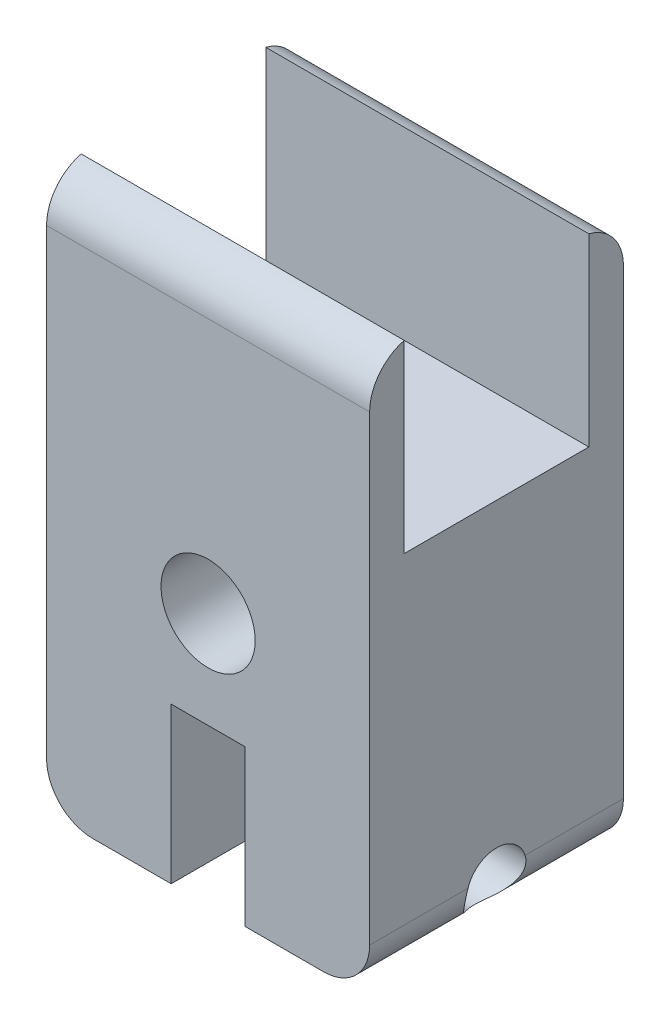
ISO-10303-21;
HEADER;
FILE_DESCRIPTION(('STEP AP214'),'2;1');
FILE_NAME('part.step','',(''),(''),'','','');
FILE_SCHEMA(('AUTOMOTIVE_DESIGN { 1 0 10303 214 1 1 1 1 }'));
ENDSEC;
DATA;
#1=APPLICATION_CONTEXT('core data for automotive mechanical design processes');
#2=APPLICATION_PROTOCOL_DEFINITION('international standard','automotive_design',2000,#1);
#3=PRODUCT_CONTEXT('',#1,'mechanical');
#4=PRODUCT('Part','Part','',(#3));
#5=PRODUCT_RELATED_PRODUCT_CATEGORY('part','',(#4));
#6=PRODUCT_DEFINITION_FORMATION('','',#4);
#7=PRODUCT_DEFINITION_CONTEXT('part definition',#1,'design');
#8=PRODUCT_DEFINITION('design','',#6,#7);
#9=PRODUCT_DEFINITION_SHAPE('','',#8);
#10=(LENGTH_UNIT() NAMED_UNIT(*) SI_UNIT(.MILLI.,.METRE.));
#11=(NAMED_UNIT(*) PLANE_ANGLE_UNIT() SI_UNIT($,.RADIAN.));
#12=(NAMED_UNIT(*) SI_UNIT($,.STERADIAN.) SOLID_ANGLE_UNIT());
#13=UNCERTAINTY_MEASURE_WITH_UNIT(LENGTH_MEASURE(1.E-05),#10,'distance_accuracy_value','');
#14=(GEOMETRIC_REPRESENTATION_CONTEXT(3) GLOBAL_UNCERTAINTY_ASSIGNED_CONTEXT((#13)) GLOBAL_UNIT_ASSIGNED_CONTEXT((#10,
#11,#12)) REPRESENTATION_CONTEXT('',''));
#15=CARTESIAN_POINT('',(0.,0.,0.));
#16=DIRECTION('',(0.,0.,1.));
#17=DIRECTION('',(1.,0.,0.));
#18=AXIS2_PLACEMENT_3D('',#15,#16,#17);
#19=CARTESIAN_POINT('',(0.,0.,27.5));
#20=DIRECTION('',(0.,0.,1.));
#21=DIRECTION('',(1.,0.,0.));
#22=AXIS2_PLACEMENT_3D('',#19,#20,#21);
#23=PLANE('',#22);
#24=CARTESIAN_POINT('',(17.5,-17.5,27.5));
#25=DIRECTION('',(0.,0.,1.));
#26=DIRECTION('',(1.,0.,0.));
#27=AXIS2_PLACEMENT_3D('',#24,#25,#26);
#28=CIRCLE('',#27,5.1);
#29=CARTESIAN_POINT('',(22.6,-17.5,27.5));
#30=VERTEX_POINT('',#29);
#31=EDGE_CURVE('E283',#30,#30,#28,.T.);
#32=ORIENTED_EDGE('',*,*,#31,.F.);
#33=EDGE_LOOP('',(#32));
#34=FACE_BOUND('',#33,.T.);
#35=DIRECTION('',(0.,1.,0.));
#36=VECTOR('',#35,1.);
#37=CARTESIAN_POINT('',(35.,0.,27.5));
#38=LINE('',#37,#36);
#39=CARTESIAN_POINT('',(35.,-39.86,27.5));
#40=VERTEX_POINT('',#39);
#41=CARTESIAN_POINT('',(35.,10.1587708172407,27.5));
#42=VERTEX_POINT('',#41);
#43=EDGE_CURVE('E293',#40,#42,#38,.T.);
#44=ORIENTED_EDGE('',*,*,#43,.T.);
#45=DIRECTION('',(1.,0.,0.));
#46=VECTOR('',#45,1.);
#47=CARTESIAN_POINT('',(0.,10.1587708172407,27.5));
#48=LINE('',#47,#46);
#49=CARTESIAN_POINT('',(0.,10.1587708172407,27.5));
#50=VERTEX_POINT('',#49);
#51=EDGE_CURVE('E11',#42,#50,#48,.F.);
#52=ORIENTED_EDGE('',*,*,#51,.T.);
#53=DIRECTION('',(0.,-1.,0.));
#54=VECTOR('',#53,1.);
#55=CARTESIAN_POINT('',(0.,0.,27.5));
#56=LINE('',#55,#54);
#57=CARTESIAN_POINT('',(0.,-39.86,27.5));
#58=VERTEX_POINT('',#57);
#59=EDGE_CURVE('E287',#50,#58,#56,.T.);
#60=ORIENTED_EDGE('',*,*,#59,.T.);
#61=CARTESIAN_POINT('',(5.00000000000001,-39.86,27.5));
#62=DIRECTION('',(0.,0.,1.));
#63=DIRECTION('',(1.,0.,0.));
#64=AXIS2_PLACEMENT_3D('',#61,#62,#63);
#65=CIRCLE('',#64,5.);
#66=CARTESIAN_POINT('',(5.,-44.86,27.5));
#67=VERTEX_POINT('',#66);
#68=EDGE_CURVE('E320',#58,#67,#65,.T.);
#69=ORIENTED_EDGE('',*,*,#68,.T.);
#70=DIRECTION('',(-1.,0.,0.));
#71=VECTOR('',#70,1.);
#72=CARTESIAN_POINT('',(35.,-44.86,27.5));
#73=LINE('',#72,#71);
#74=CARTESIAN_POINT('',(13.5,-44.86,27.5));
#75=VERTEX_POINT('',#74);
#76=EDGE_CURVE('E271',#75,#67,#73,.T.);
#77=ORIENTED_EDGE('',*,*,#76,.F.);
#78=DIRECTION('',(0.,-1.,0.));
#79=VECTOR('',#78,1.);
#80=CARTESIAN_POINT('',(13.5,-28.,27.5));
#81=LINE('',#80,#79);
#82=CARTESIAN_POINT('',(13.5,-28.,27.5));
#83=VERTEX_POINT('',#82);
#84=EDGE_CURVE('E218',#83,#75,#81,.T.);
#85=ORIENTED_EDGE('',*,*,#84,.F.);
#86=DIRECTION('',(1.,0.,0.));
#87=VECTOR('',#86,1.);
#88=CARTESIAN_POINT('',(13.5,-28.,27.5));
#89=LINE('',#88,#87);
#90=CARTESIAN_POINT('',(21.5,-28.,27.5));
#91=VERTEX_POINT('',#90);
#92=EDGE_CURVE('E226',#83,#91,#89,.T.);
#93=ORIENTED_EDGE('',*,*,#92,.T.);
#94=DIRECTION('',(0.,-1.,0.));
#95=VECTOR('',#94,1.);
#96=CARTESIAN_POINT('',(21.5,-28.,27.5));
#97=LINE('',#96,#95);
#98=CARTESIAN_POINT('',(21.5,-44.86,27.5));
#99=VERTEX_POINT('',#98);
#100=EDGE_CURVE('E221',#91,#99,#97,.T.);
#101=ORIENTED_EDGE('',*,*,#100,.T.);
#102=CARTESIAN_POINT('',(30.,-44.86,27.5));
#103=VERTEX_POINT('',#102);
#104=EDGE_CURVE('E280',#103,#99,#73,.T.);
#105=ORIENTED_EDGE('',*,*,#104,.F.);
#106=CARTESIAN_POINT('',(30.,-39.86,27.5));
#107=DIRECTION('',(0.,0.,1.));
#108=DIRECTION('',(1.,0.,0.));
#109=AXIS2_PLACEMENT_3D('',#106,#107,#108);
#110=CIRCLE('',#109,5.);
#111=EDGE_CURVE('E323',#103,#40,#110,.T.);
#112=ORIENTED_EDGE('',*,*,#111,.T.);
#113=EDGE_LOOP('',(#44,#52,#60,#69,#77,#85,#93,#101,#105,#112));
#114=FACE_BOUND('',#113,.T.);
#115=ADVANCED_FACE('F40',(#34,#114),#23,.T.);
#116=CARTESIAN_POINT('',(35.,-44.86,0.));
#117=DIRECTION('',(0.,-1.,0.));
#118=DIRECTION('',(1.,0.,0.));
#119=AXIS2_PLACEMENT_3D('',#116,#117,#118);
#120=PLANE('',#119);
#121=ORIENTED_EDGE('',*,*,#76,.T.);
#122=DIRECTION('',(0.,0.,1.));
#123=VECTOR('',#122,1.);
#124=CARTESIAN_POINT('',(5.00000000000001,-44.86,0.));
#125=LINE('',#124,#123);
#126=CARTESIAN_POINT('',(5.,-44.86,0.));
#127=VERTEX_POINT('',#126);
#128=EDGE_CURVE('E368',#67,#127,#125,.F.);
#129=ORIENTED_EDGE('',*,*,#128,.T.);
#130=DIRECTION('',(-1.,0.,0.));
#131=VECTOR('',#130,1.);
#132=CARTESIAN_POINT('',(35.,-44.86,0.));
#133=LINE('',#132,#131);
#134=CARTESIAN_POINT('',(13.5,-44.86,0.));
#135=VERTEX_POINT('',#134);
#136=EDGE_CURVE('E279',#135,#127,#133,.T.);
#137=ORIENTED_EDGE('',*,*,#136,.F.);
#138=DIRECTION('',(0.,0.,-1.));
#139=VECTOR('',#138,1.);
#140=CARTESIAN_POINT('',(13.5,-44.86,27.5));
#141=LINE('',#140,#139);
#142=EDGE_CURVE('E251',#75,#135,#141,.T.);
#143=ORIENTED_EDGE('',*,*,#142,.F.);
#144=EDGE_LOOP('',(#121,#129,#137,#143));
#145=FACE_BOUND('',#144,.T.);
#146=ADVANCED_FACE('F388',(#145),#120,.T.);
#147=CARTESIAN_POINT('',(35.,-40.86,13.75));
#148=DIRECTION('',(-1.,0.,0.));
#149=DIRECTION('',(0.,-1.,0.));
#150=AXIS2_PLACEMENT_3D('',#147,#148,#149);
#151=CYLINDRICAL_SURFACE('',#150,3.25);
#152=CARTESIAN_POINT('',(0.,-40.86,13.75));
#153=DIRECTION('',(-1.,0.,0.));
#154=DIRECTION('',(0.,-1.,0.));
#155=AXIS2_PLACEMENT_3D('',#152,#153,#154);
#156=CIRCLE('',#155,3.25);
#157=CARTESIAN_POINT('',(0.,-39.86,16.8423292192132));
#158=VERTEX_POINT('',#157);
#159=CARTESIAN_POINT('',(0.,-39.86,10.6576707807868));
#160=VERTEX_POINT('',#159);
#161=EDGE_CURVE('E266',#158,#160,#156,.T.);
#162=ORIENTED_EDGE('',*,*,#161,.T.);
#163=CARTESIAN_POINT('',(0.,-39.86,10.6576707807868));
#164=CARTESIAN_POINT('',(-1.4312730546982E-05,-39.9357347042074,10.6331647339559));
#165=CARTESIAN_POINT('',(0.00172043983442372,-40.0123804154154,10.6114671035718));
#166=CARTESIAN_POINT('',(0.00883144602176906,-40.1668868108238,10.5737769609246));
#167=CARTESIAN_POINT('',(0.0142073215578044,-40.2447473680571,10.557783856579));
#168=CARTESIAN_POINT('',(0.0287116888268035,-40.4007461470006,10.5316439449262));
#169=CARTESIAN_POINT('',(0.037823453988394,-40.4788816114201,10.5214715569186));
#170=CARTESIAN_POINT('',(0.0598169506267197,-40.6351321771363,10.5068377280575));
#171=CARTESIAN_POINT('',(0.072698539329549,-40.7132472790921,10.5023760709568));
#172=CARTESIAN_POINT('',(0.116961974239606,-40.9467006633202,10.4974413387571));
#173=CARTESIAN_POINT('',(0.153972761179332,-41.1012588880709,10.5054002044268));
#174=CARTESIAN_POINT('',(0.241675453489706,-41.403777358267,10.5421802350911));
#175=CARTESIAN_POINT('',(0.292375580955479,-41.5517335759777,10.5710139555023));
#176=CARTESIAN_POINT('',(0.407549217693916,-41.8436762436192,10.6486169935395));
#177=CARTESIAN_POINT('',(0.472482806031077,-41.9872827805407,10.6981200011328));
#178=CARTESIAN_POINT('',(0.612187553039253,-42.2622754149271,10.8142815325752));
#179=CARTESIAN_POINT('',(0.686965914159348,-42.3936524439668,10.8809526511091));
#180=CARTESIAN_POINT('',(0.822053747998413,-42.6088538229251,11.0086344392286));
#181=CARTESIAN_POINT('',(0.880701866572894,-42.6958334814822,11.0661769674196));
#182=CARTESIAN_POINT('',(1.00070909182315,-42.8627033192692,11.1882882428822));
#183=CARTESIAN_POINT('',(1.06206822284451,-42.9425934348138,11.2528570532593));
#184=CARTESIAN_POINT('',(1.18660254319613,-43.0953884557552,11.3886418955237));
#185=CARTESIAN_POINT('',(1.24978157799141,-43.16827690552,11.4598728459738));
#186=CARTESIAN_POINT('',(1.37671240954498,-43.3068255429893,11.6085359381305));
#187=CARTESIAN_POINT('',(1.44046405869507,-43.3724875387843,11.6859665202476));
#188=CARTESIAN_POINT('',(1.55779951407843,-43.4872507111575,11.8349227543247));
#189=CARTESIAN_POINT('',(1.61147804530467,-43.5373599945696,11.9055996267178));
#190=CARTESIAN_POINT('',(1.71741185300463,-43.6322232160465,12.0515141442216));
#191=CARTESIAN_POINT('',(1.76966684408042,-43.6769760862474,12.126752694267));
#192=CARTESIAN_POINT('',(1.87140757387422,-43.7607998555077,12.281801312589));
#193=CARTESIAN_POINT('',(1.92090014188232,-43.7998851869346,12.361599021115));
#194=CARTESIAN_POINT('',(2.01563479056503,-43.8721203081113,12.5261929865248));
#195=CARTESIAN_POINT('',(2.06087993546682,-43.9052743927375,12.6109855669445));
#196=CARTESIAN_POINT('',(2.15036038546252,-43.9688842055781,12.7970134441018));
#197=CARTESIAN_POINT('',(2.19374455625249,-43.9984686165115,12.8989721274099));
#198=CARTESIAN_POINT('',(2.26832636925544,-44.0480757753983,13.1094393977194));
#199=CARTESIAN_POINT('',(2.29954564694428,-44.0681155129688,13.2179359563528));
#200=CARTESIAN_POINT('',(2.3455715610016,-44.0973111529286,13.4415428201244));
#201=CARTESIAN_POINT('',(2.36015208475058,-44.10631723123,13.5567223917697));
#202=CARTESIAN_POINT('',(2.36903453134583,-44.111831169552,13.7881408713791));
#203=CARTESIAN_POINT('',(2.36335161085086,-44.1083483709965,13.9043789227336));
#204=CARTESIAN_POINT('',(2.33530364487974,-44.0907888737079,14.1162424070537));
#205=CARTESIAN_POINT('',(2.31552447750382,-44.0783515769379,14.2123780851163));
#206=CARTESIAN_POINT('',(2.26489592423126,-44.0457044085301,14.4003064880332));
#207=CARTESIAN_POINT('',(2.23403342660269,-44.0254853288959,14.4920939226606));
#208=CARTESIAN_POINT('',(2.13834638349022,-43.9607576766512,14.7367540082748));
#209=CARTESIAN_POINT('',(2.06528979943486,-43.9093466419299,14.8845696444734));
#210=CARTESIAN_POINT('',(1.94631660118729,-43.8194900582531,15.0952799127242));
#211=CARTESIAN_POINT('',(1.90498801567687,-43.7873256089114,15.1638262564813));
#212=CARTESIAN_POINT('',(1.82013169855755,-43.7189364860998,15.2974523478262));
#213=CARTESIAN_POINT('',(1.77660464323287,-43.6827130571085,15.3625331489667));
#214=CARTESIAN_POINT('',(1.66810227137774,-43.5890308121113,15.5181882722965));
#215=CARTESIAN_POINT('',(1.60236200289005,-43.5293979623672,15.606920718491));
#216=CARTESIAN_POINT('',(1.46986569868633,-43.4021185912892,15.7776764567891));
#217=CARTESIAN_POINT('',(1.40310922796184,-43.3344685488504,15.8596967740302));
#218=CARTESIAN_POINT('',(1.27014754700341,-43.1913255804722,16.0168706948084));
#219=CARTESIAN_POINT('',(1.20394182537168,-43.1158410843682,16.09203151873));
#220=CARTESIAN_POINT('',(1.07328790407541,-42.9570180635963,16.2352469319273));
#221=CARTESIAN_POINT('',(1.00883994165282,-42.8736784854381,16.3033005654295));
#222=CARTESIAN_POINT('',(0.844817137003016,-42.6464320825104,16.470544127705));
#223=CARTESIAN_POINT('',(0.74751402553405,-42.4963244046913,16.5637411567281));
#224=CARTESIAN_POINT('',(0.565509116227181,-42.1771020119158,16.7265328127908));
#225=CARTESIAN_POINT('',(0.480785034994755,-42.008021862427,16.7961694632236));
#226=CARTESIAN_POINT('',(0.341623238805143,-41.683490421172,16.8977115886233));
#227=CARTESIAN_POINT('',(0.284485300260577,-41.530610638665,16.9340195044782));
#228=CARTESIAN_POINT('',(0.209721475085806,-41.2952856035097,16.9717013559494));
#229=CARTESIAN_POINT('',(0.186623116810801,-41.2158386796419,16.9814653751511));
#230=CARTESIAN_POINT('',(0.144301983157356,-41.0554336673241,16.9951154208258));
#231=CARTESIAN_POINT('',(0.125077715939679,-40.9744761737381,16.9990037136927));
#232=CARTESIAN_POINT('',(0.0897506104842288,-40.8071824022515,17.0007053609927));
#233=CARTESIAN_POINT('',(0.0738759569303374,-40.7207940849013,16.9981748794945));
#234=CARTESIAN_POINT('',(0.0467537667066578,-40.5477674873948,16.9861295046932));
#235=CARTESIAN_POINT('',(0.0355066124879648,-40.4611291871737,16.9766140342793));
#236=CARTESIAN_POINT('',(0.0175737202989355,-40.2878456792856,16.9504467562293));
#237=CARTESIAN_POINT('',(0.0109198576786656,-40.2012045151285,16.9337463597828));
#238=CARTESIAN_POINT('',(0.00212103698002175,-40.0293323168108,16.8932987235387));
#239=CARTESIAN_POINT('',(-2.30888357207103E-05,-39.9441015458143,16.8695501839434));
#240=CARTESIAN_POINT('',(0.,-39.86,16.8423292192132));
#241=B_SPLINE_CURVE_WITH_KNOTS('',3,(#163,#164,#165,#166,#167,#168,#169,#170,#171,#172,#173,
#174,#175,#176,#177,#178,#179,#180,#181,#182,#183,#184,#185,#186,#187,#188,#189,#190,#191,#192,
#193,#194,#195,#196,#197,#198,#199,#200,#201,#202,#203,#204,#205,#206,#207,#208,#209,#210,#211,
#212,#213,#214,#215,#216,#217,#218,#219,#220,#221,#222,#223,#224,#225,#226,#227,#228,#229,#230,
#231,#232,#233,#234,#235,#236,#237,#238,#239,#240),.UNSPECIFIED.,.F.,.F.,(4,2,2,2,2,2,2,2,2,2,2,
2,2,2,2,2,2,2,2,2,2,2,2,2,2,2,2,2,2,2,2,2,2,2,2,2,2,2,4),(0.,0.238731528427206,
0.477438271288182,0.71508773293749,0.952728195292403,1.4276721783227,1.9029020593348,
2.39666745782342,2.89079612428918,3.24931443493928,3.60783596583018,3.96718048852583,
4.32643489625062,4.63196049160831,4.93754689597702,5.24234091933349,5.54691333692829,
5.88999864757722,6.23247095913534,6.57954386465145,6.92635722091858,7.2219848981532,
7.51796346534759,8.03295538614046,8.29164611734487,8.55025775016454,8.92629245649107,
9.3024929314469,9.67829273244687,10.0541430060335,10.6568018740305,11.2583800736472,
11.7576625685128,12.007330173421,12.2569014515609,12.5201205419786,12.7833613824194,
13.0484111110795,13.3135097498305),.UNSPECIFIED.);
#242=EDGE_CURVE('E360',#160,#158,#241,.T.);
#243=ORIENTED_EDGE('',*,*,#242,.T.);
#244=EDGE_LOOP('',(#162,#243));
#245=FACE_BOUND('',#244,.T.);
#246=CARTESIAN_POINT('',(13.5,-40.86,13.75));
#247=DIRECTION('',(1.,0.,0.));
#248=DIRECTION('',(0.,1.,0.));
#249=AXIS2_PLACEMENT_3D('',#246,#247,#248);
#250=CIRCLE('',#249,3.25);
#251=CARTESIAN_POINT('',(13.5,-37.61,13.75));
#252=VERTEX_POINT('',#251);
#253=EDGE_CURVE('E260',#252,#252,#250,.F.);
#254=ORIENTED_EDGE('',*,*,#253,.F.);
#255=EDGE_LOOP('',(#254));
#256=FACE_BOUND('',#255,.T.);
#257=ADVANCED_FACE('F355',(#245,#256),#151,.F.);
#258=CARTESIAN_POINT('',(0.,0.,0.));
#259=DIRECTION('',(0.,0.,1.));
#260=DIRECTION('',(1.,0.,0.));
#261=AXIS2_PLACEMENT_3D('',#258,#259,#260);
#262=PLANE('',#261);
#263=DIRECTION('',(0.,-1.,0.));
#264=VECTOR('',#263,1.);
#265=CARTESIAN_POINT('',(0.,0.,0.));
#266=LINE('',#265,#264);
#267=CARTESIAN_POINT('',(0.,10.1587708172407,0.));
#268=VERTEX_POINT('',#267);
#269=CARTESIAN_POINT('',(0.,-39.86,0.));
#270=VERTEX_POINT('',#269);
#271=EDGE_CURVE('E304',#268,#270,#266,.T.);
#272=ORIENTED_EDGE('',*,*,#271,.F.);
#273=DIRECTION('',(1.,0.,0.));
#274=VECTOR('',#273,1.);
#275=CARTESIAN_POINT('',(0.,10.1587708172407,0.));
#276=LINE('',#275,#274);
#277=CARTESIAN_POINT('',(35.,10.1587708172407,0.));
#278=VERTEX_POINT('',#277);
#279=EDGE_CURVE('E64',#268,#278,#276,.T.);
#280=ORIENTED_EDGE('',*,*,#279,.T.);
#281=DIRECTION('',(0.,1.,0.));
#282=VECTOR('',#281,1.);
#283=CARTESIAN_POINT('',(35.,0.,0.));
#284=LINE('',#283,#282);
#285=CARTESIAN_POINT('',(35.,-39.86,0.));
#286=VERTEX_POINT('',#285);
#287=EDGE_CURVE('E307',#286,#278,#284,.T.);
#288=ORIENTED_EDGE('',*,*,#287,.F.);
#289=CARTESIAN_POINT('',(30.,-39.86,0.));
#290=DIRECTION('',(0.,0.,1.));
#291=DIRECTION('',(1.,0.,0.));
#292=AXIS2_PLACEMENT_3D('',#289,#290,#291);
#293=CIRCLE('',#292,5.);
#294=CARTESIAN_POINT('',(30.,-44.86,0.));
#295=VERTEX_POINT('',#294);
#296=EDGE_CURVE('E445',#286,#295,#293,.F.);
#297=ORIENTED_EDGE('',*,*,#296,.T.);
#298=CARTESIAN_POINT('',(21.5,-44.86,0.));
#299=VERTEX_POINT('',#298);
#300=EDGE_CURVE('E275',#295,#299,#133,.T.);
#301=ORIENTED_EDGE('',*,*,#300,.T.);
#302=DIRECTION('',(0.,-1.,0.));
#303=VECTOR('',#302,1.);
#304=CARTESIAN_POINT('',(21.5,-28.,0.));
#305=LINE('',#304,#303);
#306=CARTESIAN_POINT('',(21.5,-28.,0.));
#307=VERTEX_POINT('',#306);
#308=EDGE_CURVE('E234',#307,#299,#305,.T.);
#309=ORIENTED_EDGE('',*,*,#308,.F.);
#310=DIRECTION('',(1.,0.,0.));
#311=VECTOR('',#310,1.);
#312=CARTESIAN_POINT('',(13.5,-28.,0.));
#313=LINE('',#312,#311);
#314=CARTESIAN_POINT('',(20.778719262151,-28.,0.));
#315=VERTEX_POINT('',#314);
#316=EDGE_CURVE('E238',#315,#307,#313,.T.);
#317=ORIENTED_EDGE('',*,*,#316,.F.);
#318=CARTESIAN_POINT('',(17.5,-17.5,0.));
#319=DIRECTION('',(0.,0.,1.));
#320=DIRECTION('',(1.,0.,0.));
#321=AXIS2_PLACEMENT_3D('',#318,#319,#320);
#322=CIRCLE('',#321,11.);
#323=CARTESIAN_POINT('',(14.221280737849,-28.,0.));
#324=VERTEX_POINT('',#323);
#325=EDGE_CURVE('E300',#315,#324,#322,.T.);
#326=ORIENTED_EDGE('',*,*,#325,.T.);
#327=CARTESIAN_POINT('',(13.5,-28.,0.));
#328=VERTEX_POINT('',#327);
#329=EDGE_CURVE('E222',#328,#324,#313,.T.);
#330=ORIENTED_EDGE('',*,*,#329,.F.);
#331=DIRECTION('',(0.,-1.,0.));
#332=VECTOR('',#331,1.);
#333=CARTESIAN_POINT('',(13.5,-28.,0.));
#334=LINE('',#333,#332);
#335=EDGE_CURVE('E217',#328,#135,#334,.T.);
#336=ORIENTED_EDGE('',*,*,#335,.T.);
#337=ORIENTED_EDGE('',*,*,#136,.T.);
#338=CARTESIAN_POINT('',(5.00000000000001,-39.86,0.));
#339=DIRECTION('',(0.,0.,1.));
#340=DIRECTION('',(1.,0.,0.));
#341=AXIS2_PLACEMENT_3D('',#338,#339,#340);
#342=CIRCLE('',#341,5.);
#343=EDGE_CURVE('E341',#127,#270,#342,.F.);
#344=ORIENTED_EDGE('',*,*,#343,.T.);
#345=EDGE_LOOP('',(#272,#280,#288,#297,#301,#309,#317,#326,#330,#336,#337,#344));
#346=FACE_BOUND('',#345,.T.);
#347=ADVANCED_FACE('F407',(#346),#262,.F.);
#348=CARTESIAN_POINT('',(0.,0.,3.5));
#349=DIRECTION('',(1.,0.,0.));
#350=DIRECTION('',(0.,1.,0.));
#351=AXIS2_PLACEMENT_3D('',#348,#349,#350);
#352=PLANE('',#351);
#353=DIRECTION('',(0.,0.,1.));
#354=VECTOR('',#353,1.);
#355=CARTESIAN_POINT('',(0.,-5.,3.75));
#356=LINE('',#355,#354);
#357=CARTESIAN_POINT('',(0.,-5.,3.75));
#358=VERTEX_POINT('',#357);
#359=CARTESIAN_POINT('',(0.,-5.,23.75));
#360=VERTEX_POINT('',#359);
#361=EDGE_CURVE('E196',#358,#360,#356,.T.);
#362=ORIENTED_EDGE('',*,*,#361,.F.);
#363=DIRECTION('',(0.,-1.,0.));
#364=VECTOR('',#363,1.);
#365=CARTESIAN_POINT('',(0.,0.,3.75));
#366=LINE('',#365,#364);
#367=CARTESIAN_POINT('',(0.,15.,3.75));
#368=VERTEX_POINT('',#367);
#369=EDGE_CURVE('E180',#368,#358,#366,.T.);
#370=ORIENTED_EDGE('',*,*,#369,.F.);
#371=CARTESIAN_POINT('',(0.,10.1587708172407,5.));
#372=DIRECTION('',(1.,0.,0.));
#373=DIRECTION('',(0.,1.,0.));
#374=AXIS2_PLACEMENT_3D('',#371,#372,#373);
#375=CIRCLE('',#374,5.);
#376=EDGE_CURVE('E424',#368,#268,#375,.F.);
#377=ORIENTED_EDGE('',*,*,#376,.T.);
#378=ORIENTED_EDGE('',*,*,#271,.T.);
#379=DIRECTION('',(0.,0.,1.));
#380=VECTOR('',#379,1.);
#381=CARTESIAN_POINT('',(0.,-39.86,27.5));
#382=LINE('',#381,#380);
#383=EDGE_CURVE('E369',#270,#160,#382,.T.);
#384=ORIENTED_EDGE('',*,*,#383,.T.);
#385=ORIENTED_EDGE('',*,*,#161,.F.);
#386=DIRECTION('',(0.,0.,1.));
#387=VECTOR('',#386,1.);
#388=CARTESIAN_POINT('',(0.,-39.86,27.5));
#389=LINE('',#388,#387);
#390=EDGE_CURVE('E447',#158,#58,#389,.T.);
#391=ORIENTED_EDGE('',*,*,#390,.T.);
#392=ORIENTED_EDGE('',*,*,#59,.F.);
#393=CARTESIAN_POINT('',(0.,10.1587708172407,22.5));
#394=DIRECTION('',(1.,0.,0.));
#395=DIRECTION('',(0.,1.,0.));
#396=AXIS2_PLACEMENT_3D('',#393,#394,#395);
#397=CIRCLE('',#396,5.);
#398=CARTESIAN_POINT('',(0.,15.,23.75));
#399=VERTEX_POINT('',#398);
#400=EDGE_CURVE('E418',#50,#399,#397,.F.);
#401=ORIENTED_EDGE('',*,*,#400,.T.);
#402=DIRECTION('',(0.,-1.,0.));
#403=VECTOR('',#402,1.);
#404=CARTESIAN_POINT('',(0.,0.,23.75));
#405=LINE('',#404,#403);
#406=EDGE_CURVE('E202',#399,#360,#405,.T.);
#407=ORIENTED_EDGE('',*,*,#406,.T.);
#408=EDGE_LOOP('',(#362,#370,#377,#378,#384,#385,#391,#392,#401,#407));
#409=FACE_BOUND('',#408,.T.);
#410=ADVANCED_FACE('F410',(#409),#352,.F.);
#411=CARTESIAN_POINT('',(35.,0.,3.5));
#412=DIRECTION('',(-1.,0.,0.));
#413=DIRECTION('',(0.,-1.,0.));
#414=AXIS2_PLACEMENT_3D('',#411,#412,#413);
#415=PLANE('',#414);
#416=DIRECTION('',(0.,-1.,0.));
#417=VECTOR('',#416,1.);
#418=CARTESIAN_POINT('',(35.,0.,3.75));
#419=LINE('',#418,#417);
#420=CARTESIAN_POINT('',(35.,15.,3.75));
#421=VERTEX_POINT('',#420);
#422=CARTESIAN_POINT('',(35.,-5.,3.75));
#423=VERTEX_POINT('',#422);
#424=EDGE_CURVE('E169',#421,#423,#419,.T.);
#425=ORIENTED_EDGE('',*,*,#424,.T.);
#426=DIRECTION('',(0.,0.,1.));
#427=VECTOR('',#426,1.);
#428=CARTESIAN_POINT('',(35.,-5.,3.75));
#429=LINE('',#428,#427);
#430=CARTESIAN_POINT('',(35.,-5.,23.75));
#431=VERTEX_POINT('',#430);
#432=EDGE_CURVE('E173',#423,#431,#429,.T.);
#433=ORIENTED_EDGE('',*,*,#432,.T.);
#434=DIRECTION('',(0.,-1.,0.));
#435=VECTOR('',#434,1.);
#436=CARTESIAN_POINT('',(35.,0.,23.75));
#437=LINE('',#436,#435);
#438=CARTESIAN_POINT('',(35.,15.,23.75));
#439=VERTEX_POINT('',#438);
#440=EDGE_CURVE('E204',#439,#431,#437,.T.);
#441=ORIENTED_EDGE('',*,*,#440,.F.);
#442=CARTESIAN_POINT('',(35.,10.1587708172407,22.5));
#443=DIRECTION('',(-1.,0.,0.));
#444=DIRECTION('',(0.,-1.,0.));
#445=AXIS2_PLACEMENT_3D('',#442,#443,#444);
#446=CIRCLE('',#445,5.);
#447=EDGE_CURVE('E56',#439,#42,#446,.F.);
#448=ORIENTED_EDGE('',*,*,#447,.T.);
#449=ORIENTED_EDGE('',*,*,#43,.F.);
#450=DIRECTION('',(0.,0.,1.));
#451=VECTOR('',#450,1.);
#452=CARTESIAN_POINT('',(35.,-39.86,0.));
#453=LINE('',#452,#451);
#454=CARTESIAN_POINT('',(35.,-39.86,16.8423292192132));
#455=VERTEX_POINT('',#454);
#456=EDGE_CURVE('E329',#40,#455,#453,.F.);
#457=ORIENTED_EDGE('',*,*,#456,.T.);
#458=CARTESIAN_POINT('',(35.,-40.86,13.75));
#459=DIRECTION('',(-1.,0.,0.));
#460=DIRECTION('',(0.,-1.,0.));
#461=AXIS2_PLACEMENT_3D('',#458,#459,#460);
#462=CIRCLE('',#461,3.25);
#463=CARTESIAN_POINT('',(35.,-39.86,10.6576707807868));
#464=VERTEX_POINT('',#463);
#465=EDGE_CURVE('E267',#455,#464,#462,.T.);
#466=ORIENTED_EDGE('',*,*,#465,.T.);
#467=DIRECTION('',(0.,0.,1.));
#468=VECTOR('',#467,1.);
#469=CARTESIAN_POINT('',(35.,-39.86,0.));
#470=LINE('',#469,#468);
#471=EDGE_CURVE('E326',#464,#286,#470,.F.);
#472=ORIENTED_EDGE('',*,*,#471,.T.);
#473=ORIENTED_EDGE('',*,*,#287,.T.);
#474=CARTESIAN_POINT('',(35.,10.1587708172407,5.));
#475=DIRECTION('',(-1.,0.,0.));
#476=DIRECTION('',(0.,-1.,0.));
#477=AXIS2_PLACEMENT_3D('',#474,#475,#476);
#478=CIRCLE('',#477,5.);
#479=EDGE_CURVE('E49',#278,#421,#478,.F.);
#480=ORIENTED_EDGE('',*,*,#479,.T.);
#481=EDGE_LOOP('',(#425,#433,#441,#448,#449,#457,#466,#472,#473,#480));
#482=FACE_BOUND('',#481,.T.);
#483=ADVANCED_FACE('F171',(#482),#415,.F.);
#484=CARTESIAN_POINT('',(17.5,-17.5,3.5));
#485=DIRECTION('',(0.,0.,-1.));
#486=DIRECTION('',(-1.,0.,0.));
#487=AXIS2_PLACEMENT_3D('',#484,#485,#486);
#488=CYLINDRICAL_SURFACE('',#487,11.);
#489=DIRECTION('',(0.,0.,-1.));
#490=VECTOR('',#489,1.);
#491=CARTESIAN_POINT('',(20.778719262151,-28.,3.5));
#492=LINE('',#491,#490);
#493=CARTESIAN_POINT('',(20.778719262151,-28.,3.5));
#494=VERTEX_POINT('',#493);
#495=EDGE_CURVE('E263',#494,#315,#492,.T.);
#496=ORIENTED_EDGE('',*,*,#495,.F.);
#497=CARTESIAN_POINT('',(17.5,-17.5,3.5));
#498=DIRECTION('',(0.,0.,1.));
#499=DIRECTION('',(1.,0.,0.));
#500=AXIS2_PLACEMENT_3D('',#497,#498,#499);
#501=CIRCLE('',#500,11.);
#502=CARTESIAN_POINT('',(14.221280737849,-28.,3.5));
#503=VERTEX_POINT('',#502);
#504=EDGE_CURVE('E296',#494,#503,#501,.T.);
#505=ORIENTED_EDGE('',*,*,#504,.T.);
#506=DIRECTION('',(0.,0.,-1.));
#507=VECTOR('',#506,1.);
#508=CARTESIAN_POINT('',(14.221280737849,-28.,3.5));
#509=LINE('',#508,#507);
#510=EDGE_CURVE('E259',#324,#503,#509,.F.);
#511=ORIENTED_EDGE('',*,*,#510,.F.);
#512=ORIENTED_EDGE('',*,*,#325,.F.);
#513=EDGE_LOOP('',(#496,#505,#511,#512));
#514=FACE_BOUND('',#513,.T.);
#515=ADVANCED_FACE('F402',(#514),#488,.F.);
#516=CARTESIAN_POINT('',(0.,0.,3.5));
#517=DIRECTION('',(0.,0.,1.));
#518=DIRECTION('',(1.,0.,0.));
#519=AXIS2_PLACEMENT_3D('',#516,#517,#518);
#520=PLANE('',#519);
#521=CARTESIAN_POINT('',(17.5,-17.5,3.5));
#522=DIRECTION('',(0.,0.,1.));
#523=DIRECTION('',(1.,0.,0.));
#524=AXIS2_PLACEMENT_3D('',#521,#522,#523);
#525=CIRCLE('',#524,5.1);
#526=CARTESIAN_POINT('',(22.6,-17.5,3.5));
#527=VERTEX_POINT('',#526);
#528=EDGE_CURVE('E278',#527,#527,#525,.T.);
#529=ORIENTED_EDGE('',*,*,#528,.T.);
#530=EDGE_LOOP('',(#529));
#531=FACE_BOUND('',#530,.T.);
#532=ORIENTED_EDGE('',*,*,#504,.F.);
#533=DIRECTION('',(-1.,0.,0.));
#534=VECTOR('',#533,1.);
#535=CARTESIAN_POINT('',(0.,-28.,3.5));
#536=LINE('',#535,#534);
#537=EDGE_CURVE('E255',#494,#503,#536,.T.);
#538=ORIENTED_EDGE('',*,*,#537,.T.);
#539=EDGE_LOOP('',(#532,#538));
#540=FACE_BOUND('',#539,.T.);
#541=ADVANCED_FACE('F399',(#531,#540),#520,.F.);
#542=CARTESIAN_POINT('',(17.5,-17.5,27.5));
#543=DIRECTION('',(0.,0.,-1.));
#544=DIRECTION('',(-1.,0.,0.));
#545=AXIS2_PLACEMENT_3D('',#542,#543,#544);
#546=CYLINDRICAL_SURFACE('',#545,5.1);
#547=ORIENTED_EDGE('',*,*,#31,.T.);
#548=EDGE_LOOP('',(#547));
#549=FACE_BOUND('',#548,.T.);
#550=ORIENTED_EDGE('',*,*,#528,.F.);
#551=EDGE_LOOP('',(#550));
#552=FACE_BOUND('',#551,.T.);
#553=ADVANCED_FACE('F398',(#549,#552),#546,.F.);
#554=ORIENTED_EDGE('',*,*,#300,.F.);
#555=DIRECTION('',(0.,0.,1.));
#556=VECTOR('',#555,1.);
#557=CARTESIAN_POINT('',(30.,-44.86,27.5));
#558=LINE('',#557,#556);
#559=EDGE_CURVE('E310',#295,#103,#558,.T.);
#560=ORIENTED_EDGE('',*,*,#559,.T.);
#561=ORIENTED_EDGE('',*,*,#104,.T.);
#562=DIRECTION('',(0.,0.,-1.));
#563=VECTOR('',#562,1.);
#564=CARTESIAN_POINT('',(21.5,-44.86,27.5));
#565=LINE('',#564,#563);
#566=EDGE_CURVE('E247',#99,#299,#565,.T.);
#567=ORIENTED_EDGE('',*,*,#566,.T.);
#568=EDGE_LOOP('',(#554,#560,#561,#567));
#569=FACE_BOUND('',#568,.T.);
#570=ADVANCED_FACE('F353',(#569),#120,.T.);
#571=CARTESIAN_POINT('',(21.5,-40.86,13.75));
#572=DIRECTION('',(1.,0.,0.));
#573=DIRECTION('',(0.,0.,-1.));
#574=AXIS2_PLACEMENT_3D('',#571,#572,#573);
#575=CIRCLE('',#574,3.25);
#576=CARTESIAN_POINT('',(21.5,-40.86,10.5));
#577=VERTEX_POINT('',#576);
#578=EDGE_CURVE('E254',#577,#577,#575,.F.);
#579=ORIENTED_EDGE('',*,*,#578,.T.);
#580=EDGE_LOOP('',(#579));
#581=FACE_BOUND('',#580,.T.);
#582=ORIENTED_EDGE('',*,*,#465,.F.);
#583=CARTESIAN_POINT('',(35.,-39.86,16.8423292192132));
#584=CARTESIAN_POINT('',(35.0000143127306,-39.9357347042074,16.8668352660441));
#585=CARTESIAN_POINT('',(34.9982795601656,-40.0123804154154,16.8885328964282));
#586=CARTESIAN_POINT('',(34.9911685539782,-40.1668868108238,16.9262230390754));
#587=CARTESIAN_POINT('',(34.9857926784422,-40.2447473680571,16.942216143421));
#588=CARTESIAN_POINT('',(34.9712883111732,-40.4007461470006,16.9683560550738));
#589=CARTESIAN_POINT('',(34.9621765460116,-40.4788816114201,16.9785284430814));
#590=CARTESIAN_POINT('',(34.9401830493733,-40.6351321771363,16.9931622719425));
#591=CARTESIAN_POINT('',(34.9273014606705,-40.7132472790921,16.9976239290432));
#592=CARTESIAN_POINT('',(34.8830380257604,-40.9467006633201,17.0025586612429));
#593=CARTESIAN_POINT('',(34.8460272388207,-41.1012588880709,16.9945997955732));
#594=CARTESIAN_POINT('',(34.7583245465103,-41.403777358267,16.9578197649089));
#595=CARTESIAN_POINT('',(34.7076244190445,-41.5517335759776,16.9289860444977));
#596=CARTESIAN_POINT('',(34.5924507823061,-41.8436762436192,16.8513830064605));
#597=CARTESIAN_POINT('',(34.5275171939689,-41.9872827805407,16.8018799988672));
#598=CARTESIAN_POINT('',(34.3878124469608,-42.2622754149271,16.6857184674248));
#599=CARTESIAN_POINT('',(34.3130340858407,-42.3936524439668,16.6190473488909));
#600=CARTESIAN_POINT('',(34.1779462520016,-42.6088538229251,16.4913655607714));
#601=CARTESIAN_POINT('',(34.1192981334271,-42.6958334814822,16.4338230325804));
#602=CARTESIAN_POINT('',(33.9992909081769,-42.8627033192692,16.3117117571178));
#603=CARTESIAN_POINT('',(33.9379317771555,-42.9425934348138,16.2471429467407));
#604=CARTESIAN_POINT('',(33.8133974568039,-43.0953884557551,16.1113581044763));
#605=CARTESIAN_POINT('',(33.7502184220086,-43.16827690552,16.0401271540262));
#606=CARTESIAN_POINT('',(33.623287590455,-43.3068255429893,15.8914640618695));
#607=CARTESIAN_POINT('',(33.5595359413049,-43.3724875387843,15.8140334797524));
#608=CARTESIAN_POINT('',(33.4422004859216,-43.4872507111575,15.6650772456753));
#609=CARTESIAN_POINT('',(33.3885219546953,-43.5373599945696,15.5944003732822));
#610=CARTESIAN_POINT('',(33.2825881469954,-43.6322232160465,15.4484858557784));
#611=CARTESIAN_POINT('',(33.2303331559196,-43.6769760862474,15.373247305733));
#612=CARTESIAN_POINT('',(33.1285924261258,-43.7607998555077,15.218198687411));
#613=CARTESIAN_POINT('',(33.0790998581177,-43.7998851869346,15.138400978885));
#614=CARTESIAN_POINT('',(32.984365209435,-43.8721203081113,14.9738070134752));
#615=CARTESIAN_POINT('',(32.9391200645332,-43.9052743927375,14.8890144330555));
#616=CARTESIAN_POINT('',(32.8496396145375,-43.9688842055781,14.7029865558982));
#617=CARTESIAN_POINT('',(32.8062554437475,-43.9984686165115,14.6010278725901));
#618=CARTESIAN_POINT('',(32.7316736307446,-44.0480757753983,14.3905606022806));
#619=CARTESIAN_POINT('',(32.7004543530557,-44.0681155129688,14.2820640436472));
#620=CARTESIAN_POINT('',(32.6544284389984,-44.0973111529286,14.0584571798756));
#621=CARTESIAN_POINT('',(32.6398479152494,-44.10631723123,13.9432776082303));
#622=CARTESIAN_POINT('',(32.6309654686542,-44.111831169552,13.7118591286209));
#623=CARTESIAN_POINT('',(32.6366483891491,-44.1083483709965,13.5956210772664));
#624=CARTESIAN_POINT('',(32.6646963551203,-44.0907888737079,13.3837575929463));
#625=CARTESIAN_POINT('',(32.6844755224962,-44.0783515769379,13.2876219148837));
#626=CARTESIAN_POINT('',(32.7351040757688,-44.0457044085301,13.0996935119668));
#627=CARTESIAN_POINT('',(32.7659665733973,-44.0254853288959,13.0079060773394));
#628=CARTESIAN_POINT('',(32.8616536165098,-43.9607576766512,12.7632459917252));
#629=CARTESIAN_POINT('',(32.9347102005652,-43.9093466419299,12.6154303555266));
#630=CARTESIAN_POINT('',(33.0536833988127,-43.8194900582531,12.4047200872758));
#631=CARTESIAN_POINT('',(33.0950119843231,-43.7873256089114,12.3361737435187));
#632=CARTESIAN_POINT('',(33.1798683014424,-43.7189364860998,12.2025476521738));
#633=CARTESIAN_POINT('',(33.2233953567671,-43.6827130571085,12.1374668510333));
#634=CARTESIAN_POINT('',(33.3318977286223,-43.5890308121113,11.9818117277035));
#635=CARTESIAN_POINT('',(33.39763799711,-43.5293979623672,11.893079281509));
#636=CARTESIAN_POINT('',(33.5301343013137,-43.4021185912892,11.7223235432109));
#637=CARTESIAN_POINT('',(33.5968907720382,-43.3344685488504,11.6403032259698));
#638=CARTESIAN_POINT('',(33.7298524529966,-43.1913255804722,11.4831293051916));
#639=CARTESIAN_POINT('',(33.7960581746283,-43.1158410843682,11.40796848127));
#640=CARTESIAN_POINT('',(33.9267120959246,-42.9570180635963,11.2647530680727));
#641=CARTESIAN_POINT('',(33.9911600583472,-42.8736784854381,11.1966994345705));
#642=CARTESIAN_POINT('',(34.155182862997,-42.6464320825104,11.029455872295));
#643=CARTESIAN_POINT('',(34.252485974466,-42.4963244046913,10.9362588432719));
#644=CARTESIAN_POINT('',(34.4344908837728,-42.1771020119158,10.7734671872092));
#645=CARTESIAN_POINT('',(34.5192149650053,-42.008021862427,10.7038305367764));
#646=CARTESIAN_POINT('',(34.6583767611949,-41.683490421172,10.6022884113767));
#647=CARTESIAN_POINT('',(34.7155146997394,-41.530610638665,10.5659804955218));
#648=CARTESIAN_POINT('',(34.7902785249142,-41.2952856035097,10.5282986440506));
#649=CARTESIAN_POINT('',(34.8133768831892,-41.2158386796419,10.5185346248489));
#650=CARTESIAN_POINT('',(34.8556980168427,-41.0554336673241,10.5048845791742));
#651=CARTESIAN_POINT('',(34.8749222840603,-40.9744761737381,10.5009962863073));
#652=CARTESIAN_POINT('',(34.9102493895158,-40.8071824022515,10.4992946390073));
#653=CARTESIAN_POINT('',(34.9261240430697,-40.7207940849013,10.5018251205055));
#654=CARTESIAN_POINT('',(34.9532462332934,-40.5477674873948,10.5138704953068));
#655=CARTESIAN_POINT('',(34.9644933875121,-40.4611291871737,10.5233859657207));
#656=CARTESIAN_POINT('',(34.9824262797011,-40.2878456792856,10.5495532437707));
#657=CARTESIAN_POINT('',(34.9890801423213,-40.2012045151285,10.5662536402173));
#658=CARTESIAN_POINT('',(34.99787896302,-40.0293323168108,10.6067012764613));
#659=CARTESIAN_POINT('',(35.0000230888357,-39.9441015458142,10.6304498160566));
#660=CARTESIAN_POINT('',(35.,-39.86,10.6576707807868));
#661=B_SPLINE_CURVE_WITH_KNOTS('',3,(#583,#584,#585,#586,#587,#588,#589,#590,#591,#592,#593,
#594,#595,#596,#597,#598,#599,#600,#601,#602,#603,#604,#605,#606,#607,#608,#609,#610,#611,#612,
#613,#614,#615,#616,#617,#618,#619,#620,#621,#622,#623,#624,#625,#626,#627,#628,#629,#630,#631,
#632,#633,#634,#635,#636,#637,#638,#639,#640,#641,#642,#643,#644,#645,#646,#647,#648,#649,#650,
#651,#652,#653,#654,#655,#656,#657,#658,#659,#660),.UNSPECIFIED.,.F.,.F.,(4,2,2,2,2,2,2,2,2,2,2,
2,2,2,2,2,2,2,2,2,2,2,2,2,2,2,2,2,2,2,2,2,2,2,2,2,2,2,4),(0.,0.238731528427213,
0.477438271288174,0.715087732937496,0.952728195292403,1.4276721783227,1.9029020593348,
2.39666745782342,2.89079612428918,3.24931443493929,3.60783596583019,3.96718048852583,
4.32643489625062,4.6319604916083,4.93754689597702,5.24234091933349,5.5469133369283,
5.88999864757722,6.23247095913534,6.57954386465145,6.92635722091858,7.2219848981532,
7.51796346534759,8.03295538614046,8.29164611734486,8.55025775016453,8.92629245649107,
9.3024929314469,9.67829273244686,10.0541430060335,10.6568018740306,11.2583800736472,
11.7576625685128,12.007330173421,12.2569014515609,12.5201205419786,12.7833613824194,
13.0484111110795,13.3135097498305),.UNSPECIFIED.);
#662=EDGE_CURVE('E332',#455,#464,#661,.T.);
#663=ORIENTED_EDGE('',*,*,#662,.T.);
#664=EDGE_LOOP('',(#582,#663));
#665=FACE_BOUND('',#664,.T.);
#666=ADVANCED_FACE('F347',(#581,#665),#151,.F.);
#667=CARTESIAN_POINT('',(13.5,-28.,27.5));
#668=DIRECTION('',(1.,0.,0.));
#669=DIRECTION('',(0.,1.,0.));
#670=AXIS2_PLACEMENT_3D('',#667,#668,#669);
#671=PLANE('',#670);
#672=ORIENTED_EDGE('',*,*,#335,.F.);
#673=DIRECTION('',(0.,0.,-1.));
#674=VECTOR('',#673,1.);
#675=CARTESIAN_POINT('',(13.5,-28.,27.5));
#676=LINE('',#675,#674);
#677=EDGE_CURVE('E230',#83,#328,#676,.T.);
#678=ORIENTED_EDGE('',*,*,#677,.F.);
#679=ORIENTED_EDGE('',*,*,#84,.T.);
#680=ORIENTED_EDGE('',*,*,#142,.T.);
#681=EDGE_LOOP('',(#672,#678,#679,#680));
#682=FACE_BOUND('',#681,.T.);
#683=ORIENTED_EDGE('',*,*,#253,.T.);
#684=EDGE_LOOP('',(#683));
#685=FACE_BOUND('',#684,.T.);
#686=ADVANCED_FACE('F352',(#682,#685),#671,.T.);
#687=CARTESIAN_POINT('',(21.5,-28.,27.5));
#688=DIRECTION('',(1.,0.,0.));
#689=DIRECTION('',(0.,0.,-1.));
#690=AXIS2_PLACEMENT_3D('',#687,#688,#689);
#691=PLANE('',#690);
#692=ORIENTED_EDGE('',*,*,#308,.T.);
#693=ORIENTED_EDGE('',*,*,#566,.F.);
#694=ORIENTED_EDGE('',*,*,#100,.F.);
#695=DIRECTION('',(0.,0.,-1.));
#696=VECTOR('',#695,1.);
#697=CARTESIAN_POINT('',(21.5,-28.,27.5));
#698=LINE('',#697,#696);
#699=EDGE_CURVE('E243',#91,#307,#698,.T.);
#700=ORIENTED_EDGE('',*,*,#699,.T.);
#701=EDGE_LOOP('',(#692,#693,#694,#700));
#702=FACE_BOUND('',#701,.T.);
#703=ORIENTED_EDGE('',*,*,#578,.F.);
#704=EDGE_LOOP('',(#703));
#705=FACE_BOUND('',#704,.T.);
#706=ADVANCED_FACE('F471',(#702,#705),#691,.F.);
#707=CARTESIAN_POINT('',(13.5,-28.,27.5));
#708=DIRECTION('',(0.,1.,0.));
#709=DIRECTION('',(0.,0.,1.));
#710=AXIS2_PLACEMENT_3D('',#707,#708,#709);
#711=PLANE('',#710);
#712=ORIENTED_EDGE('',*,*,#495,.T.);
#713=ORIENTED_EDGE('',*,*,#316,.T.);
#714=ORIENTED_EDGE('',*,*,#699,.F.);
#715=ORIENTED_EDGE('',*,*,#92,.F.);
#716=ORIENTED_EDGE('',*,*,#677,.T.);
#717=ORIENTED_EDGE('',*,*,#329,.T.);
#718=ORIENTED_EDGE('',*,*,#510,.T.);
#719=ORIENTED_EDGE('',*,*,#537,.F.);
#720=EDGE_LOOP('',(#712,#713,#714,#715,#716,#717,#718,#719));
#721=FACE_BOUND('',#720,.T.);
#722=ADVANCED_FACE('F481',(#721),#711,.F.);
#723=CARTESIAN_POINT('',(30.,-39.86,0.));
#724=DIRECTION('',(0.,0.,-1.));
#725=DIRECTION('',(-1.,0.,0.));
#726=AXIS2_PLACEMENT_3D('',#723,#724,#725);
#727=CYLINDRICAL_SURFACE('',#726,5.);
#728=ORIENTED_EDGE('',*,*,#662,.F.);
#729=ORIENTED_EDGE('',*,*,#456,.F.);
#730=ORIENTED_EDGE('',*,*,#111,.F.);
#731=ORIENTED_EDGE('',*,*,#559,.F.);
#732=ORIENTED_EDGE('',*,*,#296,.F.);
#733=ORIENTED_EDGE('',*,*,#471,.F.);
#734=EDGE_LOOP('',(#728,#729,#730,#731,#732,#733));
#735=FACE_BOUND('',#734,.T.);
#736=ADVANCED_FACE('F343',(#735),#727,.T.);
#737=CARTESIAN_POINT('',(5.00000000000001,-39.86,3.5));
#738=DIRECTION('',(0.,0.,-1.));
#739=DIRECTION('',(-1.,0.,0.));
#740=AXIS2_PLACEMENT_3D('',#737,#738,#739);
#741=CYLINDRICAL_SURFACE('',#740,5.);
#742=ORIENTED_EDGE('',*,*,#343,.F.);
#743=ORIENTED_EDGE('',*,*,#128,.F.);
#744=ORIENTED_EDGE('',*,*,#68,.F.);
#745=ORIENTED_EDGE('',*,*,#390,.F.);
#746=ORIENTED_EDGE('',*,*,#242,.F.);
#747=ORIENTED_EDGE('',*,*,#383,.F.);
#748=EDGE_LOOP('',(#742,#743,#744,#745,#746,#747));
#749=FACE_BOUND('',#748,.T.);
#750=ADVANCED_FACE('F372',(#749),#741,.T.);
#751=CARTESIAN_POINT('',(35.,0.,3.75));
#752=DIRECTION('',(0.,0.,-1.));
#753=DIRECTION('',(0.,1.,0.));
#754=AXIS2_PLACEMENT_3D('',#751,#752,#753);
#755=PLANE('',#754);
#756=ORIENTED_EDGE('',*,*,#369,.T.);
#757=DIRECTION('',(-1.,0.,0.));
#758=VECTOR('',#757,1.);
#759=CARTESIAN_POINT('',(35.,-5.,3.75));
#760=LINE('',#759,#758);
#761=EDGE_CURVE('E183',#423,#358,#760,.T.);
#762=ORIENTED_EDGE('',*,*,#761,.F.);
#763=ORIENTED_EDGE('',*,*,#424,.F.);
#764=DIRECTION('',(-1.,0.,0.));
#765=VECTOR('',#764,1.);
#766=CARTESIAN_POINT('',(35.,15.,3.75));
#767=LINE('',#766,#765);
#768=EDGE_CURVE('E179',#421,#368,#767,.T.);
#769=ORIENTED_EDGE('',*,*,#768,.T.);
#770=EDGE_LOOP('',(#756,#762,#763,#769));
#771=FACE_BOUND('',#770,.T.);
#772=ADVANCED_FACE('F184',(#771),#755,.F.);
#773=CARTESIAN_POINT('',(35.,0.,23.75));
#774=DIRECTION('',(0.,0.,-1.));
#775=DIRECTION('',(0.,1.,0.));
#776=AXIS2_PLACEMENT_3D('',#773,#774,#775);
#777=PLANE('',#776);
#778=ORIENTED_EDGE('',*,*,#406,.F.);
#779=DIRECTION('',(-1.,0.,0.));
#780=VECTOR('',#779,1.);
#781=CARTESIAN_POINT('',(35.,15.,23.75));
#782=LINE('',#781,#780);
#783=EDGE_CURVE('E207',#439,#399,#782,.T.);
#784=ORIENTED_EDGE('',*,*,#783,.F.);
#785=ORIENTED_EDGE('',*,*,#440,.T.);
#786=DIRECTION('',(-1.,0.,0.));
#787=VECTOR('',#786,1.);
#788=CARTESIAN_POINT('',(35.,-5.,23.75));
#789=LINE('',#788,#787);
#790=EDGE_CURVE('E190',#431,#360,#789,.T.);
#791=ORIENTED_EDGE('',*,*,#790,.T.);
#792=EDGE_LOOP('',(#778,#784,#785,#791));
#793=FACE_BOUND('',#792,.T.);
#794=ADVANCED_FACE('F378',(#793),#777,.T.);
#795=CARTESIAN_POINT('',(35.,10.1587708172407,5.));
#796=DIRECTION('',(1.,0.,0.));
#797=DIRECTION('',(0.,1.,0.));
#798=AXIS2_PLACEMENT_3D('',#795,#796,#797);
#799=CYLINDRICAL_SURFACE('',#798,5.);
#800=ORIENTED_EDGE('',*,*,#479,.F.);
#801=ORIENTED_EDGE('',*,*,#279,.F.);
#802=ORIENTED_EDGE('',*,*,#376,.F.);
#803=ORIENTED_EDGE('',*,*,#768,.F.);
#804=EDGE_LOOP('',(#800,#801,#802,#803));
#805=FACE_BOUND('',#804,.T.);
#806=ADVANCED_FACE('F376',(#805),#799,.T.);
#807=CARTESIAN_POINT('',(35.,10.1587708172407,22.5));
#808=DIRECTION('',(-1.,0.,0.));
#809=DIRECTION('',(0.,-1.,0.));
#810=AXIS2_PLACEMENT_3D('',#807,#808,#809);
#811=CYLINDRICAL_SURFACE('',#810,5.);
#812=ORIENTED_EDGE('',*,*,#447,.F.);
#813=ORIENTED_EDGE('',*,*,#783,.T.);
#814=ORIENTED_EDGE('',*,*,#400,.F.);
#815=ORIENTED_EDGE('',*,*,#51,.F.);
#816=EDGE_LOOP('',(#812,#813,#814,#815));
#817=FACE_BOUND('',#816,.T.);
#818=ADVANCED_FACE('F42',(#817),#811,.T.);
#819=CARTESIAN_POINT('',(35.,-5.,3.75));
#820=DIRECTION('',(0.,-1.,0.));
#821=DIRECTION('',(1.,0.,0.));
#822=AXIS2_PLACEMENT_3D('',#819,#820,#821);
#823=PLANE('',#822);
#824=ORIENTED_EDGE('',*,*,#361,.T.);
#825=ORIENTED_EDGE('',*,*,#790,.F.);
#826=ORIENTED_EDGE('',*,*,#432,.F.);
#827=ORIENTED_EDGE('',*,*,#761,.T.);
#828=EDGE_LOOP('',(#824,#825,#826,#827));
#829=FACE_BOUND('',#828,.T.);
#830=ADVANCED_FACE('F193',(#829),#823,.F.);
#831=CLOSED_SHELL('',(#115,#146,#257,#347,#410,#483,#515,#541,#553,#570,#666,#686,#706,#722,
#736,#750,#772,#794,#806,#818,#830));
#832=MANIFOLD_SOLID_BREP('B2',#831);
#833=ADVANCED_BREP_SHAPE_REPRESENTATION('',(#18,#832),#14);
#834=SHAPE_DEFINITION_REPRESENTATION(#9,#833);
ENDSEC;
END-ISO-10303-21;
